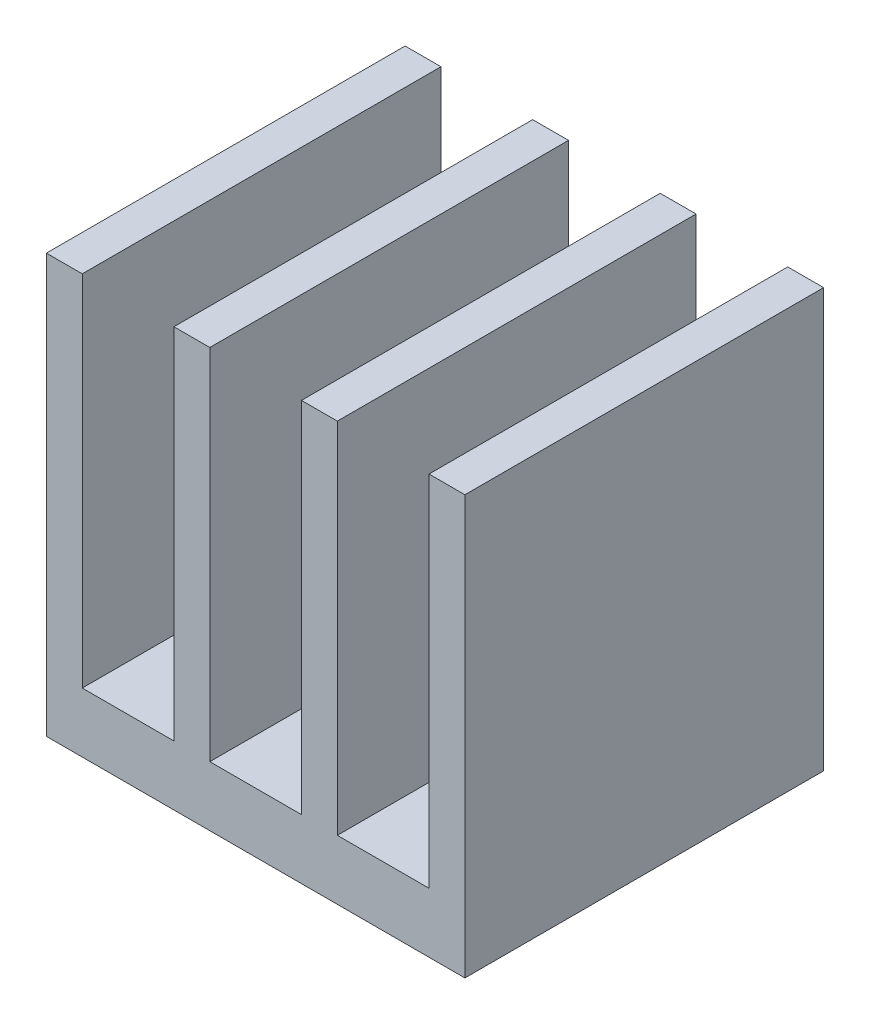
ISO-10303-21;
HEADER;
FILE_DESCRIPTION(('STEP AP214'),'2;1');
FILE_NAME('part.step','',(''),(''),'','','');
FILE_SCHEMA(('AUTOMOTIVE_DESIGN { 1 0 10303 214 1 1 1 1 }'));
ENDSEC;
DATA;
#1=APPLICATION_CONTEXT('core data for automotive mechanical design processes');
#2=APPLICATION_PROTOCOL_DEFINITION('international standard','automotive_design',2000,#1);
#3=PRODUCT_CONTEXT('',#1,'mechanical');
#4=PRODUCT('Part','Part','',(#3));
#5=PRODUCT_RELATED_PRODUCT_CATEGORY('part','',(#4));
#6=PRODUCT_DEFINITION_FORMATION('','',#4);
#7=PRODUCT_DEFINITION_CONTEXT('part definition',#1,'design');
#8=PRODUCT_DEFINITION('design','',#6,#7);
#9=PRODUCT_DEFINITION_SHAPE('','',#8);
#10=(LENGTH_UNIT() NAMED_UNIT(*) SI_UNIT(.MILLI.,.METRE.));
#11=(NAMED_UNIT(*) PLANE_ANGLE_UNIT() SI_UNIT($,.RADIAN.));
#12=(NAMED_UNIT(*) SI_UNIT($,.STERADIAN.) SOLID_ANGLE_UNIT());
#13=UNCERTAINTY_MEASURE_WITH_UNIT(LENGTH_MEASURE(1.E-05),#10,'distance_accuracy_value','');
#14=(GEOMETRIC_REPRESENTATION_CONTEXT(3) GLOBAL_UNCERTAINTY_ASSIGNED_CONTEXT((#13)) GLOBAL_UNIT_ASSIGNED_CONTEXT((#10,
#11,#12)) REPRESENTATION_CONTEXT('',''));
#15=CARTESIAN_POINT('',(0.,0.,0.));
#16=DIRECTION('',(0.,0.,1.));
#17=DIRECTION('',(1.,0.,0.));
#18=AXIS2_PLACEMENT_3D('',#15,#16,#17);
#19=CARTESIAN_POINT('',(-3.5,0.,6.));
#20=DIRECTION('',(1.,0.,0.));
#21=DIRECTION('',(0.,1.,0.));
#22=AXIS2_PLACEMENT_3D('',#19,#20,#21);
#23=PLANE('',#22);
#24=DIRECTION('',(0.,-1.,0.));
#25=VECTOR('',#24,1.);
#26=CARTESIAN_POINT('',(-3.5,0.,0.));
#27=LINE('',#26,#25);
#28=CARTESIAN_POINT('',(-3.5,7.,0.));
#29=VERTEX_POINT('',#28);
#30=CARTESIAN_POINT('',(-3.5,0.,0.));
#31=VERTEX_POINT('',#30);
#32=EDGE_CURVE('E181',#29,#31,#27,.T.);
#33=ORIENTED_EDGE('',*,*,#32,.T.);
#34=DIRECTION('',(0.,0.,-1.));
#35=VECTOR('',#34,1.);
#36=CARTESIAN_POINT('',(-3.5,0.,6.));
#37=LINE('',#36,#35);
#38=CARTESIAN_POINT('',(-3.5,0.,6.));
#39=VERTEX_POINT('',#38);
#40=EDGE_CURVE('E11',#39,#31,#37,.T.);
#41=ORIENTED_EDGE('',*,*,#40,.F.);
#42=DIRECTION('',(0.,-1.,0.));
#43=VECTOR('',#42,1.);
#44=CARTESIAN_POINT('',(-3.5,0.,6.));
#45=LINE('',#44,#43);
#46=CARTESIAN_POINT('',(-3.5,7.,6.));
#47=VERTEX_POINT('',#46);
#48=EDGE_CURVE('E211',#47,#39,#45,.T.);
#49=ORIENTED_EDGE('',*,*,#48,.F.);
#50=DIRECTION('',(0.,0.,-1.));
#51=VECTOR('',#50,1.);
#52=CARTESIAN_POINT('',(-3.5,7.,6.));
#53=LINE('',#52,#51);
#54=EDGE_CURVE('E177',#47,#29,#53,.T.);
#55=ORIENTED_EDGE('',*,*,#54,.T.);
#56=EDGE_LOOP('',(#33,#41,#49,#55));
#57=FACE_BOUND('',#56,.T.);
#58=ADVANCED_FACE('F37',(#57),#23,.F.);
#59=CARTESIAN_POINT('',(-3.5,0.,6.));
#60=DIRECTION('',(0.,1.,0.));
#61=DIRECTION('',(0.,0.,1.));
#62=AXIS2_PLACEMENT_3D('',#59,#60,#61);
#63=PLANE('',#62);
#64=DIRECTION('',(1.,0.,0.));
#65=VECTOR('',#64,1.);
#66=CARTESIAN_POINT('',(-3.5,0.,0.));
#67=LINE('',#66,#65);
#68=CARTESIAN_POINT('',(3.5,0.,0.));
#69=VERTEX_POINT('',#68);
#70=EDGE_CURVE('E184',#31,#69,#67,.T.);
#71=ORIENTED_EDGE('',*,*,#70,.T.);
#72=DIRECTION('',(0.,0.,-1.));
#73=VECTOR('',#72,1.);
#74=CARTESIAN_POINT('',(3.5,0.,6.));
#75=LINE('',#74,#73);
#76=CARTESIAN_POINT('',(3.5,0.,6.));
#77=VERTEX_POINT('',#76);
#78=EDGE_CURVE('E45',#77,#69,#75,.T.);
#79=ORIENTED_EDGE('',*,*,#78,.F.);
#80=DIRECTION('',(1.,0.,0.));
#81=VECTOR('',#80,1.);
#82=CARTESIAN_POINT('',(-3.5,0.,6.));
#83=LINE('',#82,#81);
#84=EDGE_CURVE('E120',#39,#77,#83,.T.);
#85=ORIENTED_EDGE('',*,*,#84,.F.);
#86=ORIENTED_EDGE('',*,*,#40,.T.);
#87=EDGE_LOOP('',(#71,#79,#85,#86));
#88=FACE_BOUND('',#87,.T.);
#89=ADVANCED_FACE('F309',(#88),#63,.F.);
#90=CARTESIAN_POINT('',(3.5,7.,6.));
#91=DIRECTION('',(-1.,0.,0.));
#92=DIRECTION('',(0.,0.,1.));
#93=AXIS2_PLACEMENT_3D('',#90,#91,#92);
#94=PLANE('',#93);
#95=DIRECTION('',(0.,1.,0.));
#96=VECTOR('',#95,1.);
#97=CARTESIAN_POINT('',(3.5,7.,0.));
#98=LINE('',#97,#96);
#99=CARTESIAN_POINT('',(3.5,7.,0.));
#100=VERTEX_POINT('',#99);
#101=EDGE_CURVE('E186',#69,#100,#98,.T.);
#102=ORIENTED_EDGE('',*,*,#101,.T.);
#103=DIRECTION('',(0.,0.,-1.));
#104=VECTOR('',#103,1.);
#105=CARTESIAN_POINT('',(3.5,7.,6.));
#106=LINE('',#105,#104);
#107=CARTESIAN_POINT('',(3.5,7.,6.));
#108=VERTEX_POINT('',#107);
#109=EDGE_CURVE('E242',#108,#100,#106,.T.);
#110=ORIENTED_EDGE('',*,*,#109,.F.);
#111=DIRECTION('',(0.,1.,0.));
#112=VECTOR('',#111,1.);
#113=CARTESIAN_POINT('',(3.5,7.,6.));
#114=LINE('',#113,#112);
#115=EDGE_CURVE('E250',#77,#108,#114,.T.);
#116=ORIENTED_EDGE('',*,*,#115,.F.);
#117=ORIENTED_EDGE('',*,*,#78,.T.);
#118=EDGE_LOOP('',(#102,#110,#116,#117));
#119=FACE_BOUND('',#118,.T.);
#120=ADVANCED_FACE('F248',(#119),#94,.F.);
#121=CARTESIAN_POINT('',(2.9,7.,6.));
#122=DIRECTION('',(0.,-1.,0.));
#123=DIRECTION('',(0.,0.,-1.));
#124=AXIS2_PLACEMENT_3D('',#121,#122,#123);
#125=PLANE('',#124);
#126=DIRECTION('',(-1.,0.,0.));
#127=VECTOR('',#126,1.);
#128=CARTESIAN_POINT('',(2.9,7.,0.));
#129=LINE('',#128,#127);
#130=CARTESIAN_POINT('',(2.9,7.,0.));
#131=VERTEX_POINT('',#130);
#132=EDGE_CURVE('E188',#100,#131,#129,.T.);
#133=ORIENTED_EDGE('',*,*,#132,.T.);
#134=DIRECTION('',(0.,0.,-1.));
#135=VECTOR('',#134,1.);
#136=CARTESIAN_POINT('',(2.9,7.,6.));
#137=LINE('',#136,#135);
#138=CARTESIAN_POINT('',(2.9,7.,6.));
#139=VERTEX_POINT('',#138);
#140=EDGE_CURVE('E239',#139,#131,#137,.T.);
#141=ORIENTED_EDGE('',*,*,#140,.F.);
#142=DIRECTION('',(-1.,0.,0.));
#143=VECTOR('',#142,1.);
#144=CARTESIAN_POINT('',(2.9,7.,6.));
#145=LINE('',#144,#143);
#146=EDGE_CURVE('E268',#108,#139,#145,.T.);
#147=ORIENTED_EDGE('',*,*,#146,.F.);
#148=ORIENTED_EDGE('',*,*,#109,.T.);
#149=EDGE_LOOP('',(#133,#141,#147,#148));
#150=FACE_BOUND('',#149,.T.);
#151=ADVANCED_FACE('F259',(#150),#125,.F.);
#152=CARTESIAN_POINT('',(2.9,1.,6.));
#153=DIRECTION('',(1.,0.,0.));
#154=DIRECTION('',(0.,0.,-1.));
#155=AXIS2_PLACEMENT_3D('',#152,#153,#154);
#156=PLANE('',#155);
#157=DIRECTION('',(0.,-1.,0.));
#158=VECTOR('',#157,1.);
#159=CARTESIAN_POINT('',(2.9,1.,0.));
#160=LINE('',#159,#158);
#161=CARTESIAN_POINT('',(2.9,1.,0.));
#162=VERTEX_POINT('',#161);
#163=EDGE_CURVE('E190',#131,#162,#160,.T.);
#164=ORIENTED_EDGE('',*,*,#163,.T.);
#165=DIRECTION('',(0.,0.,-1.));
#166=VECTOR('',#165,1.);
#167=CARTESIAN_POINT('',(2.9,1.,6.));
#168=LINE('',#167,#166);
#169=CARTESIAN_POINT('',(2.9,1.,6.));
#170=VERTEX_POINT('',#169);
#171=EDGE_CURVE('E236',#170,#162,#168,.T.);
#172=ORIENTED_EDGE('',*,*,#171,.F.);
#173=DIRECTION('',(0.,-1.,0.));
#174=VECTOR('',#173,1.);
#175=CARTESIAN_POINT('',(2.9,1.,6.));
#176=LINE('',#175,#174);
#177=EDGE_CURVE('E265',#139,#170,#176,.T.);
#178=ORIENTED_EDGE('',*,*,#177,.F.);
#179=ORIENTED_EDGE('',*,*,#140,.T.);
#180=EDGE_LOOP('',(#164,#172,#178,#179));
#181=FACE_BOUND('',#180,.T.);
#182=ADVANCED_FACE('F263',(#181),#156,.F.);
#183=CARTESIAN_POINT('',(1.36666666666667,1.,6.));
#184=DIRECTION('',(0.,-1.,0.));
#185=DIRECTION('',(0.,0.,-1.));
#186=AXIS2_PLACEMENT_3D('',#183,#184,#185);
#187=PLANE('',#186);
#188=DIRECTION('',(-1.,0.,0.));
#189=VECTOR('',#188,1.);
#190=CARTESIAN_POINT('',(1.36666666666667,1.,0.));
#191=LINE('',#190,#189);
#192=CARTESIAN_POINT('',(1.36666666666667,1.,0.));
#193=VERTEX_POINT('',#192);
#194=EDGE_CURVE('E192',#162,#193,#191,.T.);
#195=ORIENTED_EDGE('',*,*,#194,.T.);
#196=DIRECTION('',(0.,0.,-1.));
#197=VECTOR('',#196,1.);
#198=CARTESIAN_POINT('',(1.36666666666667,1.,6.));
#199=LINE('',#198,#197);
#200=CARTESIAN_POINT('',(1.36666666666667,1.,6.));
#201=VERTEX_POINT('',#200);
#202=EDGE_CURVE('E233',#201,#193,#199,.T.);
#203=ORIENTED_EDGE('',*,*,#202,.F.);
#204=DIRECTION('',(-1.,0.,0.));
#205=VECTOR('',#204,1.);
#206=CARTESIAN_POINT('',(1.36666666666667,1.,6.));
#207=LINE('',#206,#205);
#208=EDGE_CURVE('E267',#170,#201,#207,.T.);
#209=ORIENTED_EDGE('',*,*,#208,.F.);
#210=ORIENTED_EDGE('',*,*,#171,.T.);
#211=EDGE_LOOP('',(#195,#203,#209,#210));
#212=FACE_BOUND('',#211,.T.);
#213=ADVANCED_FACE('F322',(#212),#187,.F.);
#214=CARTESIAN_POINT('',(1.36666666666667,7.,6.));
#215=DIRECTION('',(-1.,0.,0.));
#216=DIRECTION('',(0.,0.,1.));
#217=AXIS2_PLACEMENT_3D('',#214,#215,#216);
#218=PLANE('',#217);
#219=DIRECTION('',(0.,1.,0.));
#220=VECTOR('',#219,1.);
#221=CARTESIAN_POINT('',(1.36666666666667,7.,0.));
#222=LINE('',#221,#220);
#223=CARTESIAN_POINT('',(1.36666666666667,7.,0.));
#224=VERTEX_POINT('',#223);
#225=EDGE_CURVE('E194',#193,#224,#222,.T.);
#226=ORIENTED_EDGE('',*,*,#225,.T.);
#227=DIRECTION('',(0.,0.,-1.));
#228=VECTOR('',#227,1.);
#229=CARTESIAN_POINT('',(1.36666666666667,7.,6.));
#230=LINE('',#229,#228);
#231=CARTESIAN_POINT('',(1.36666666666667,7.,6.));
#232=VERTEX_POINT('',#231);
#233=EDGE_CURVE('E230',#232,#224,#230,.T.);
#234=ORIENTED_EDGE('',*,*,#233,.F.);
#235=DIRECTION('',(0.,1.,0.));
#236=VECTOR('',#235,1.);
#237=CARTESIAN_POINT('',(1.36666666666667,7.,6.));
#238=LINE('',#237,#236);
#239=EDGE_CURVE('E270',#201,#232,#238,.T.);
#240=ORIENTED_EDGE('',*,*,#239,.F.);
#241=ORIENTED_EDGE('',*,*,#202,.T.);
#242=EDGE_LOOP('',(#226,#234,#240,#241));
#243=FACE_BOUND('',#242,.T.);
#244=ADVANCED_FACE('F325',(#243),#218,.F.);
#245=CARTESIAN_POINT('',(0.766666666666667,7.,6.));
#246=DIRECTION('',(0.,-1.,0.));
#247=DIRECTION('',(0.,0.,-1.));
#248=AXIS2_PLACEMENT_3D('',#245,#246,#247);
#249=PLANE('',#248);
#250=DIRECTION('',(-1.,0.,0.));
#251=VECTOR('',#250,1.);
#252=CARTESIAN_POINT('',(0.766666666666667,7.,0.));
#253=LINE('',#252,#251);
#254=CARTESIAN_POINT('',(0.766666666666667,7.,0.));
#255=VERTEX_POINT('',#254);
#256=EDGE_CURVE('E196',#224,#255,#253,.T.);
#257=ORIENTED_EDGE('',*,*,#256,.T.);
#258=DIRECTION('',(0.,0.,-1.));
#259=VECTOR('',#258,1.);
#260=CARTESIAN_POINT('',(0.766666666666667,7.,6.));
#261=LINE('',#260,#259);
#262=CARTESIAN_POINT('',(0.766666666666667,7.,6.));
#263=VERTEX_POINT('',#262);
#264=EDGE_CURVE('E227',#263,#255,#261,.T.);
#265=ORIENTED_EDGE('',*,*,#264,.F.);
#266=DIRECTION('',(-1.,0.,0.));
#267=VECTOR('',#266,1.);
#268=CARTESIAN_POINT('',(0.766666666666667,7.,6.));
#269=LINE('',#268,#267);
#270=EDGE_CURVE('E276',#232,#263,#269,.T.);
#271=ORIENTED_EDGE('',*,*,#270,.F.);
#272=ORIENTED_EDGE('',*,*,#233,.T.);
#273=EDGE_LOOP('',(#257,#265,#271,#272));
#274=FACE_BOUND('',#273,.T.);
#275=ADVANCED_FACE('F329',(#274),#249,.F.);
#276=CARTESIAN_POINT('',(0.766666666666666,1.,6.));
#277=DIRECTION('',(1.,0.,0.));
#278=DIRECTION('',(0.,1.,0.));
#279=AXIS2_PLACEMENT_3D('',#276,#277,#278);
#280=PLANE('',#279);
#281=DIRECTION('',(0.,-1.,0.));
#282=VECTOR('',#281,1.);
#283=CARTESIAN_POINT('',(0.766666666666666,1.,0.));
#284=LINE('',#283,#282);
#285=CARTESIAN_POINT('',(0.766666666666666,1.,0.));
#286=VERTEX_POINT('',#285);
#287=EDGE_CURVE('E198',#255,#286,#284,.T.);
#288=ORIENTED_EDGE('',*,*,#287,.T.);
#289=DIRECTION('',(0.,0.,-1.));
#290=VECTOR('',#289,1.);
#291=CARTESIAN_POINT('',(0.766666666666666,1.,6.));
#292=LINE('',#291,#290);
#293=CARTESIAN_POINT('',(0.766666666666666,1.,6.));
#294=VERTEX_POINT('',#293);
#295=EDGE_CURVE('E224',#294,#286,#292,.T.);
#296=ORIENTED_EDGE('',*,*,#295,.F.);
#297=DIRECTION('',(0.,-1.,0.));
#298=VECTOR('',#297,1.);
#299=CARTESIAN_POINT('',(0.766666666666666,1.,6.));
#300=LINE('',#299,#298);
#301=EDGE_CURVE('E278',#263,#294,#300,.T.);
#302=ORIENTED_EDGE('',*,*,#301,.F.);
#303=ORIENTED_EDGE('',*,*,#264,.T.);
#304=EDGE_LOOP('',(#288,#296,#302,#303));
#305=FACE_BOUND('',#304,.T.);
#306=ADVANCED_FACE('F333',(#305),#280,.F.);
#307=CARTESIAN_POINT('',(-0.766666666666668,1.,6.));
#308=DIRECTION('',(0.,-1.,0.));
#309=DIRECTION('',(0.,0.,-1.));
#310=AXIS2_PLACEMENT_3D('',#307,#308,#309);
#311=PLANE('',#310);
#312=DIRECTION('',(-1.,0.,0.));
#313=VECTOR('',#312,1.);
#314=CARTESIAN_POINT('',(-0.766666666666668,1.,0.));
#315=LINE('',#314,#313);
#316=CARTESIAN_POINT('',(-0.766666666666668,1.,0.));
#317=VERTEX_POINT('',#316);
#318=EDGE_CURVE('E200',#286,#317,#315,.T.);
#319=ORIENTED_EDGE('',*,*,#318,.T.);
#320=DIRECTION('',(0.,0.,-1.));
#321=VECTOR('',#320,1.);
#322=CARTESIAN_POINT('',(-0.766666666666668,1.,6.));
#323=LINE('',#322,#321);
#324=CARTESIAN_POINT('',(-0.766666666666668,1.,6.));
#325=VERTEX_POINT('',#324);
#326=EDGE_CURVE('E221',#325,#317,#323,.T.);
#327=ORIENTED_EDGE('',*,*,#326,.F.);
#328=DIRECTION('',(-1.,0.,0.));
#329=VECTOR('',#328,1.);
#330=CARTESIAN_POINT('',(-0.766666666666668,1.,6.));
#331=LINE('',#330,#329);
#332=EDGE_CURVE('E280',#294,#325,#331,.T.);
#333=ORIENTED_EDGE('',*,*,#332,.F.);
#334=ORIENTED_EDGE('',*,*,#295,.T.);
#335=EDGE_LOOP('',(#319,#327,#333,#334));
#336=FACE_BOUND('',#335,.T.);
#337=ADVANCED_FACE('F337',(#336),#311,.F.);
#338=CARTESIAN_POINT('',(-0.766666666666668,7.,6.));
#339=DIRECTION('',(-1.,0.,0.));
#340=DIRECTION('',(0.,0.,1.));
#341=AXIS2_PLACEMENT_3D('',#338,#339,#340);
#342=PLANE('',#341);
#343=DIRECTION('',(0.,1.,0.));
#344=VECTOR('',#343,1.);
#345=CARTESIAN_POINT('',(-0.766666666666668,7.,0.));
#346=LINE('',#345,#344);
#347=CARTESIAN_POINT('',(-0.766666666666668,7.,0.));
#348=VERTEX_POINT('',#347);
#349=EDGE_CURVE('E202',#317,#348,#346,.T.);
#350=ORIENTED_EDGE('',*,*,#349,.T.);
#351=DIRECTION('',(0.,0.,-1.));
#352=VECTOR('',#351,1.);
#353=CARTESIAN_POINT('',(-0.766666666666668,7.,6.));
#354=LINE('',#353,#352);
#355=CARTESIAN_POINT('',(-0.766666666666668,7.,6.));
#356=VERTEX_POINT('',#355);
#357=EDGE_CURVE('E218',#356,#348,#354,.T.);
#358=ORIENTED_EDGE('',*,*,#357,.F.);
#359=DIRECTION('',(0.,1.,0.));
#360=VECTOR('',#359,1.);
#361=CARTESIAN_POINT('',(-0.766666666666668,7.,6.));
#362=LINE('',#361,#360);
#363=EDGE_CURVE('E282',#325,#356,#362,.T.);
#364=ORIENTED_EDGE('',*,*,#363,.F.);
#365=ORIENTED_EDGE('',*,*,#326,.T.);
#366=EDGE_LOOP('',(#350,#358,#364,#365));
#367=FACE_BOUND('',#366,.T.);
#368=ADVANCED_FACE('F341',(#367),#342,.F.);
#369=CARTESIAN_POINT('',(-1.36666666666667,7.,6.));
#370=DIRECTION('',(0.,-1.,0.));
#371=DIRECTION('',(0.,0.,-1.));
#372=AXIS2_PLACEMENT_3D('',#369,#370,#371);
#373=PLANE('',#372);
#374=DIRECTION('',(-1.,0.,0.));
#375=VECTOR('',#374,1.);
#376=CARTESIAN_POINT('',(-1.36666666666667,7.,0.));
#377=LINE('',#376,#375);
#378=CARTESIAN_POINT('',(-1.36666666666667,7.,0.));
#379=VERTEX_POINT('',#378);
#380=EDGE_CURVE('E204',#348,#379,#377,.T.);
#381=ORIENTED_EDGE('',*,*,#380,.T.);
#382=DIRECTION('',(0.,0.,-1.));
#383=VECTOR('',#382,1.);
#384=CARTESIAN_POINT('',(-1.36666666666667,7.,6.));
#385=LINE('',#384,#383);
#386=CARTESIAN_POINT('',(-1.36666666666667,7.,6.));
#387=VERTEX_POINT('',#386);
#388=EDGE_CURVE('E215',#387,#379,#385,.T.);
#389=ORIENTED_EDGE('',*,*,#388,.F.);
#390=DIRECTION('',(-1.,0.,0.));
#391=VECTOR('',#390,1.);
#392=CARTESIAN_POINT('',(-1.36666666666667,7.,6.));
#393=LINE('',#392,#391);
#394=EDGE_CURVE('E284',#356,#387,#393,.T.);
#395=ORIENTED_EDGE('',*,*,#394,.F.);
#396=ORIENTED_EDGE('',*,*,#357,.T.);
#397=EDGE_LOOP('',(#381,#389,#395,#396));
#398=FACE_BOUND('',#397,.T.);
#399=ADVANCED_FACE('F290',(#398),#373,.F.);
#400=CARTESIAN_POINT('',(-1.36666666666667,1.,6.));
#401=DIRECTION('',(1.,0.,0.));
#402=DIRECTION('',(0.,0.,-1.));
#403=AXIS2_PLACEMENT_3D('',#400,#401,#402);
#404=PLANE('',#403);
#405=DIRECTION('',(0.,-1.,0.));
#406=VECTOR('',#405,1.);
#407=CARTESIAN_POINT('',(-1.36666666666667,1.,0.));
#408=LINE('',#407,#406);
#409=CARTESIAN_POINT('',(-1.36666666666667,1.,0.));
#410=VERTEX_POINT('',#409);
#411=EDGE_CURVE('E206',#379,#410,#408,.T.);
#412=ORIENTED_EDGE('',*,*,#411,.T.);
#413=DIRECTION('',(0.,0.,-1.));
#414=VECTOR('',#413,1.);
#415=CARTESIAN_POINT('',(-1.36666666666667,1.,6.));
#416=LINE('',#415,#414);
#417=CARTESIAN_POINT('',(-1.36666666666667,1.,6.));
#418=VERTEX_POINT('',#417);
#419=EDGE_CURVE('E172',#418,#410,#416,.T.);
#420=ORIENTED_EDGE('',*,*,#419,.F.);
#421=DIRECTION('',(0.,-1.,0.));
#422=VECTOR('',#421,1.);
#423=CARTESIAN_POINT('',(-1.36666666666667,1.,6.));
#424=LINE('',#423,#422);
#425=EDGE_CURVE('E163',#387,#418,#424,.T.);
#426=ORIENTED_EDGE('',*,*,#425,.F.);
#427=ORIENTED_EDGE('',*,*,#388,.T.);
#428=EDGE_LOOP('',(#412,#420,#426,#427));
#429=FACE_BOUND('',#428,.T.);
#430=ADVANCED_FACE('F294',(#429),#404,.F.);
#431=CARTESIAN_POINT('',(-2.9,1.,6.));
#432=DIRECTION('',(0.,-1.,0.));
#433=DIRECTION('',(0.,0.,-1.));
#434=AXIS2_PLACEMENT_3D('',#431,#432,#433);
#435=PLANE('',#434);
#436=DIRECTION('',(-1.,0.,0.));
#437=VECTOR('',#436,1.);
#438=CARTESIAN_POINT('',(-2.9,1.,0.));
#439=LINE('',#438,#437);
#440=CARTESIAN_POINT('',(-2.9,1.,0.));
#441=VERTEX_POINT('',#440);
#442=EDGE_CURVE('E171',#410,#441,#439,.T.);
#443=ORIENTED_EDGE('',*,*,#442,.T.);
#444=DIRECTION('',(0.,0.,-1.));
#445=VECTOR('',#444,1.);
#446=CARTESIAN_POINT('',(-2.9,1.,6.));
#447=LINE('',#446,#445);
#448=CARTESIAN_POINT('',(-2.9,1.,6.));
#449=VERTEX_POINT('',#448);
#450=EDGE_CURVE('E168',#449,#441,#447,.T.);
#451=ORIENTED_EDGE('',*,*,#450,.F.);
#452=DIRECTION('',(-1.,0.,0.));
#453=VECTOR('',#452,1.);
#454=CARTESIAN_POINT('',(-2.9,1.,6.));
#455=LINE('',#454,#453);
#456=EDGE_CURVE('E157',#418,#449,#455,.T.);
#457=ORIENTED_EDGE('',*,*,#456,.F.);
#458=ORIENTED_EDGE('',*,*,#419,.T.);
#459=EDGE_LOOP('',(#443,#451,#457,#458));
#460=FACE_BOUND('',#459,.T.);
#461=ADVANCED_FACE('F169',(#460),#435,.F.);
#462=CARTESIAN_POINT('',(-2.9,7.,6.));
#463=DIRECTION('',(-1.,0.,0.));
#464=DIRECTION('',(0.,-1.,0.));
#465=AXIS2_PLACEMENT_3D('',#462,#463,#464);
#466=PLANE('',#465);
#467=DIRECTION('',(0.,1.,0.));
#468=VECTOR('',#467,1.);
#469=CARTESIAN_POINT('',(-2.9,7.,0.));
#470=LINE('',#469,#468);
#471=CARTESIAN_POINT('',(-2.9,7.,0.));
#472=VERTEX_POINT('',#471);
#473=EDGE_CURVE('E106',#441,#472,#470,.T.);
#474=ORIENTED_EDGE('',*,*,#473,.T.);
#475=DIRECTION('',(0.,0.,-1.));
#476=VECTOR('',#475,1.);
#477=CARTESIAN_POINT('',(-2.9,7.,6.));
#478=LINE('',#477,#476);
#479=CARTESIAN_POINT('',(-2.9,7.,6.));
#480=VERTEX_POINT('',#479);
#481=EDGE_CURVE('E173',#480,#472,#478,.T.);
#482=ORIENTED_EDGE('',*,*,#481,.F.);
#483=DIRECTION('',(0.,1.,0.));
#484=VECTOR('',#483,1.);
#485=CARTESIAN_POINT('',(-2.9,7.,6.));
#486=LINE('',#485,#484);
#487=EDGE_CURVE('E161',#449,#480,#486,.T.);
#488=ORIENTED_EDGE('',*,*,#487,.F.);
#489=ORIENTED_EDGE('',*,*,#450,.T.);
#490=EDGE_LOOP('',(#474,#482,#488,#489));
#491=FACE_BOUND('',#490,.T.);
#492=ADVANCED_FACE('F175',(#491),#466,.F.);
#493=CARTESIAN_POINT('',(-3.5,7.,6.));
#494=DIRECTION('',(0.,-1.,0.));
#495=DIRECTION('',(0.,0.,-1.));
#496=AXIS2_PLACEMENT_3D('',#493,#494,#495);
#497=PLANE('',#496);
#498=DIRECTION('',(-1.,0.,0.));
#499=VECTOR('',#498,1.);
#500=CARTESIAN_POINT('',(-3.5,7.,0.));
#501=LINE('',#500,#499);
#502=EDGE_CURVE('E112',#472,#29,#501,.T.);
#503=ORIENTED_EDGE('',*,*,#502,.T.);
#504=ORIENTED_EDGE('',*,*,#54,.F.);
#505=DIRECTION('',(-1.,0.,0.));
#506=VECTOR('',#505,1.);
#507=CARTESIAN_POINT('',(-3.5,7.,6.));
#508=LINE('',#507,#506);
#509=EDGE_CURVE('E53',#480,#47,#508,.T.);
#510=ORIENTED_EDGE('',*,*,#509,.F.);
#511=ORIENTED_EDGE('',*,*,#481,.T.);
#512=EDGE_LOOP('',(#503,#504,#510,#511));
#513=FACE_BOUND('',#512,.T.);
#514=ADVANCED_FACE('F298',(#513),#497,.F.);
#515=CARTESIAN_POINT('',(0.,0.,6.));
#516=DIRECTION('',(0.,0.,-1.));
#517=DIRECTION('',(-1.,0.,0.));
#518=AXIS2_PLACEMENT_3D('',#515,#516,#517);
#519=PLANE('',#518);
#520=ORIENTED_EDGE('',*,*,#48,.T.);
#521=ORIENTED_EDGE('',*,*,#84,.T.);
#522=ORIENTED_EDGE('',*,*,#115,.T.);
#523=ORIENTED_EDGE('',*,*,#146,.T.);
#524=ORIENTED_EDGE('',*,*,#177,.T.);
#525=ORIENTED_EDGE('',*,*,#208,.T.);
#526=ORIENTED_EDGE('',*,*,#239,.T.);
#527=ORIENTED_EDGE('',*,*,#270,.T.);
#528=ORIENTED_EDGE('',*,*,#301,.T.);
#529=ORIENTED_EDGE('',*,*,#332,.T.);
#530=ORIENTED_EDGE('',*,*,#363,.T.);
#531=ORIENTED_EDGE('',*,*,#394,.T.);
#532=ORIENTED_EDGE('',*,*,#425,.T.);
#533=ORIENTED_EDGE('',*,*,#456,.T.);
#534=ORIENTED_EDGE('',*,*,#487,.T.);
#535=ORIENTED_EDGE('',*,*,#509,.T.);
#536=EDGE_LOOP('',(#520,#521,#522,#523,#524,#525,#526,#527,#528,#529,#530,#531,#532,#533,#534,#535));
#537=FACE_BOUND('',#536,.T.);
#538=ADVANCED_FACE('F159',(#537),#519,.F.);
#539=CARTESIAN_POINT('',(0.,0.,0.));
#540=DIRECTION('',(0.,0.,-1.));
#541=DIRECTION('',(-1.,0.,0.));
#542=AXIS2_PLACEMENT_3D('',#539,#540,#541);
#543=PLANE('',#542);
#544=ORIENTED_EDGE('',*,*,#32,.F.);
#545=ORIENTED_EDGE('',*,*,#502,.F.);
#546=ORIENTED_EDGE('',*,*,#473,.F.);
#547=ORIENTED_EDGE('',*,*,#442,.F.);
#548=ORIENTED_EDGE('',*,*,#411,.F.);
#549=ORIENTED_EDGE('',*,*,#380,.F.);
#550=ORIENTED_EDGE('',*,*,#349,.F.);
#551=ORIENTED_EDGE('',*,*,#318,.F.);
#552=ORIENTED_EDGE('',*,*,#287,.F.);
#553=ORIENTED_EDGE('',*,*,#256,.F.);
#554=ORIENTED_EDGE('',*,*,#225,.F.);
#555=ORIENTED_EDGE('',*,*,#194,.F.);
#556=ORIENTED_EDGE('',*,*,#163,.F.);
#557=ORIENTED_EDGE('',*,*,#132,.F.);
#558=ORIENTED_EDGE('',*,*,#101,.F.);
#559=ORIENTED_EDGE('',*,*,#70,.F.);
#560=EDGE_LOOP('',(#544,#545,#546,#547,#548,#549,#550,#551,#552,#553,#554,#555,#556,#557,#558,#559));
#561=FACE_BOUND('',#560,.T.);
#562=ADVANCED_FACE('F254',(#561),#543,.T.);
#563=CLOSED_SHELL('',(#58,#89,#120,#151,#182,#213,#244,#275,#306,#337,#368,#399,#430,#461,#492,
#514,#538,#562));
#564=MANIFOLD_SOLID_BREP('B2',#563);
#565=ADVANCED_BREP_SHAPE_REPRESENTATION('',(#18,#564),#14);
#566=SHAPE_DEFINITION_REPRESENTATION(#9,#565);
ENDSEC;
END-ISO-10303-21;
